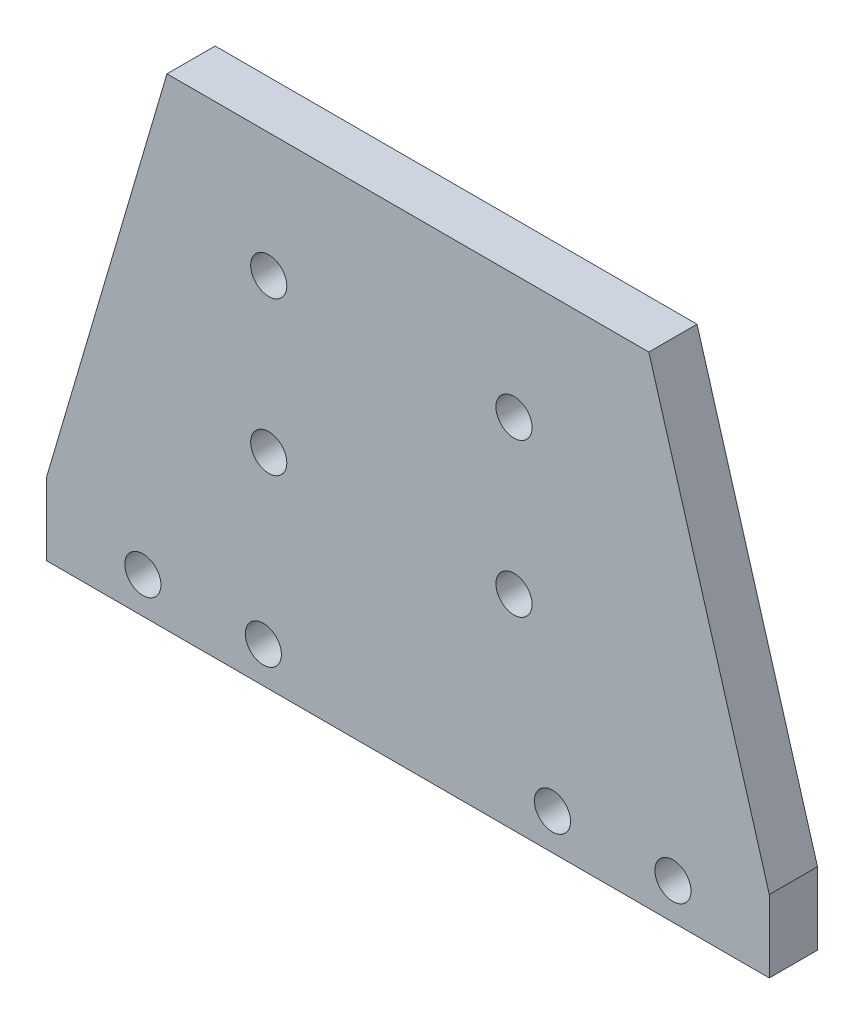
ISO-10303-21;
HEADER;
FILE_DESCRIPTION(('STEP AP214'),'2;1');
FILE_NAME('part.step','',(''),(''),'','','');
FILE_SCHEMA(('AUTOMOTIVE_DESIGN { 1 0 10303 214 1 1 1 1 }'));
ENDSEC;
DATA;
#1=APPLICATION_CONTEXT('core data for automotive mechanical design processes');
#2=APPLICATION_PROTOCOL_DEFINITION('international standard','automotive_design',2000,#1);
#3=PRODUCT_CONTEXT('',#1,'mechanical');
#4=PRODUCT('Part','Part','',(#3));
#5=PRODUCT_RELATED_PRODUCT_CATEGORY('part','',(#4));
#6=PRODUCT_DEFINITION_FORMATION('','',#4);
#7=PRODUCT_DEFINITION_CONTEXT('part definition',#1,'design');
#8=PRODUCT_DEFINITION('design','',#6,#7);
#9=PRODUCT_DEFINITION_SHAPE('','',#8);
#10=(LENGTH_UNIT() NAMED_UNIT(*) SI_UNIT(.MILLI.,.METRE.));
#11=(NAMED_UNIT(*) PLANE_ANGLE_UNIT() SI_UNIT($,.RADIAN.));
#12=(NAMED_UNIT(*) SI_UNIT($,.STERADIAN.) SOLID_ANGLE_UNIT());
#13=UNCERTAINTY_MEASURE_WITH_UNIT(LENGTH_MEASURE(1.E-05),#10,'distance_accuracy_value','');
#14=(GEOMETRIC_REPRESENTATION_CONTEXT(3) GLOBAL_UNCERTAINTY_ASSIGNED_CONTEXT((#13)) GLOBAL_UNIT_ASSIGNED_CONTEXT((#10,
#11,#12)) REPRESENTATION_CONTEXT('',''));
#15=CARTESIAN_POINT('',(0.,0.,0.));
#16=DIRECTION('',(0.,0.,1.));
#17=DIRECTION('',(1.,0.,0.));
#18=AXIS2_PLACEMENT_3D('',#15,#16,#17);
#19=CARTESIAN_POINT('',(30.,-20.,4.));
#20=DIRECTION('',(-1.,0.,0.));
#21=DIRECTION('',(0.,0.,1.));
#22=AXIS2_PLACEMENT_3D('',#19,#20,#21);
#23=PLANE('',#22);
#24=DIRECTION('',(0.,0.,-1.));
#25=VECTOR('',#24,1.);
#26=CARTESIAN_POINT('',(30.,-14.,4.000012));
#27=LINE('',#26,#25);
#28=CARTESIAN_POINT('',(30.,-14.,4.));
#29=VERTEX_POINT('',#28);
#30=CARTESIAN_POINT('',(30.,-14.,0.));
#31=VERTEX_POINT('',#30);
#32=EDGE_CURVE('E67',#29,#31,#27,.T.);
#33=ORIENTED_EDGE('',*,*,#32,.F.);
#34=DIRECTION('',(0.,1.,0.));
#35=VECTOR('',#34,1.);
#36=CARTESIAN_POINT('',(30.,-20.,4.));
#37=LINE('',#36,#35);
#38=CARTESIAN_POINT('',(30.,-20.,4.));
#39=VERTEX_POINT('',#38);
#40=EDGE_CURVE('E119',#39,#29,#37,.T.);
#41=ORIENTED_EDGE('',*,*,#40,.F.);
#42=DIRECTION('',(0.,0.,-1.));
#43=VECTOR('',#42,1.);
#44=CARTESIAN_POINT('',(30.,-20.,4.));
#45=LINE('',#44,#43);
#46=CARTESIAN_POINT('',(30.,-20.,0.));
#47=VERTEX_POINT('',#46);
#48=EDGE_CURVE('E51',#39,#47,#45,.T.);
#49=ORIENTED_EDGE('',*,*,#48,.T.);
#50=DIRECTION('',(0.,1.,0.));
#51=VECTOR('',#50,1.);
#52=CARTESIAN_POINT('',(30.,-20.,0.));
#53=LINE('',#52,#51);
#54=EDGE_CURVE('E121',#47,#31,#53,.T.);
#55=ORIENTED_EDGE('',*,*,#54,.T.);
#56=EDGE_LOOP('',(#33,#41,#49,#55));
#57=FACE_BOUND('',#56,.T.);
#58=ADVANCED_FACE('F43',(#57),#23,.F.);
#59=CARTESIAN_POINT('',(-30.,20.,4.));
#60=DIRECTION('',(0.,-1.,0.));
#61=DIRECTION('',(0.,0.,-1.));
#62=AXIS2_PLACEMENT_3D('',#59,#60,#61);
#63=PLANE('',#62);
#64=DIRECTION('',(0.,0.,-1.));
#65=VECTOR('',#64,1.);
#66=CARTESIAN_POINT('',(-20.,20.,4.000012));
#67=LINE('',#66,#65);
#68=CARTESIAN_POINT('',(-20.,20.,4.));
#69=VERTEX_POINT('',#68);
#70=CARTESIAN_POINT('',(-20.,20.,0.));
#71=VERTEX_POINT('',#70);
#72=EDGE_CURVE('E59',#69,#71,#67,.T.);
#73=ORIENTED_EDGE('',*,*,#72,.F.);
#74=DIRECTION('',(-1.,0.,0.));
#75=VECTOR('',#74,1.);
#76=CARTESIAN_POINT('',(-30.,20.,4.));
#77=LINE('',#76,#75);
#78=CARTESIAN_POINT('',(20.,20.,4.));
#79=VERTEX_POINT('',#78);
#80=EDGE_CURVE('E176',#79,#69,#77,.T.);
#81=ORIENTED_EDGE('',*,*,#80,.F.);
#82=DIRECTION('',(0.,0.,-1.));
#83=VECTOR('',#82,1.);
#84=CARTESIAN_POINT('',(20.,20.,4.000012));
#85=LINE('',#84,#83);
#86=CARTESIAN_POINT('',(20.,20.,0.));
#87=VERTEX_POINT('',#86);
#88=EDGE_CURVE('E164',#79,#87,#85,.T.);
#89=ORIENTED_EDGE('',*,*,#88,.T.);
#90=DIRECTION('',(-1.,0.,0.));
#91=VECTOR('',#90,1.);
#92=CARTESIAN_POINT('',(-30.,20.,0.));
#93=LINE('',#92,#91);
#94=EDGE_CURVE('E117',#87,#71,#93,.T.);
#95=ORIENTED_EDGE('',*,*,#94,.T.);
#96=EDGE_LOOP('',(#73,#81,#89,#95));
#97=FACE_BOUND('',#96,.T.);
#98=ADVANCED_FACE('F188',(#97),#63,.F.);
#99=CARTESIAN_POINT('',(-30.,-20.,4.));
#100=DIRECTION('',(1.,0.,0.));
#101=DIRECTION('',(0.,0.,-1.));
#102=AXIS2_PLACEMENT_3D('',#99,#100,#101);
#103=PLANE('',#102);
#104=DIRECTION('',(0.,0.,-1.));
#105=VECTOR('',#104,1.);
#106=CARTESIAN_POINT('',(-30.,-14.,4.000012));
#107=LINE('',#106,#105);
#108=CARTESIAN_POINT('',(-30.,-14.,4.));
#109=VERTEX_POINT('',#108);
#110=CARTESIAN_POINT('',(-30.,-14.,0.));
#111=VERTEX_POINT('',#110);
#112=EDGE_CURVE('E97',#109,#111,#107,.T.);
#113=ORIENTED_EDGE('',*,*,#112,.T.);
#114=DIRECTION('',(0.,-1.,0.));
#115=VECTOR('',#114,1.);
#116=CARTESIAN_POINT('',(-30.,-20.,0.));
#117=LINE('',#116,#115);
#118=CARTESIAN_POINT('',(-30.,-20.,0.));
#119=VERTEX_POINT('',#118);
#120=EDGE_CURVE('E109',#111,#119,#117,.T.);
#121=ORIENTED_EDGE('',*,*,#120,.T.);
#122=DIRECTION('',(0.,0.,-1.));
#123=VECTOR('',#122,1.);
#124=CARTESIAN_POINT('',(-30.,-20.,4.));
#125=LINE('',#124,#123);
#126=CARTESIAN_POINT('',(-30.,-20.,4.));
#127=VERTEX_POINT('',#126);
#128=EDGE_CURVE('E11',#127,#119,#125,.T.);
#129=ORIENTED_EDGE('',*,*,#128,.F.);
#130=DIRECTION('',(0.,-1.,0.));
#131=VECTOR('',#130,1.);
#132=CARTESIAN_POINT('',(-30.,-20.,4.));
#133=LINE('',#132,#131);
#134=EDGE_CURVE('E110',#109,#127,#133,.T.);
#135=ORIENTED_EDGE('',*,*,#134,.F.);
#136=EDGE_LOOP('',(#113,#121,#129,#135));
#137=FACE_BOUND('',#136,.T.);
#138=ADVANCED_FACE('F107',(#137),#103,.F.);
#139=CARTESIAN_POINT('',(0.,0.,4.));
#140=DIRECTION('',(0.,0.,-1.));
#141=DIRECTION('',(-1.,0.,0.));
#142=AXIS2_PLACEMENT_3D('',#139,#140,#141);
#143=PLANE('',#142);
#144=CARTESIAN_POINT('',(-11.5523120479037,9.71625644938022,4.));
#145=DIRECTION('',(0.,0.,1.));
#146=DIRECTION('',(1.,0.,0.));
#147=AXIS2_PLACEMENT_3D('',#144,#145,#146);
#148=CIRCLE('',#147,1.50000000010472);
#149=CARTESIAN_POINT('',(-10.052312047799,9.71625644938022,4.));
#150=VERTEX_POINT('',#149);
#151=EDGE_CURVE('E262',#150,#150,#148,.T.);
#152=ORIENTED_EDGE('',*,*,#151,.F.);
#153=EDGE_LOOP('',(#152));
#154=FACE_BOUND('',#153,.T.);
#155=CARTESIAN_POINT('',(8.80778672416417,-2.99728939019158,4.));
#156=DIRECTION('',(0.,0.,1.));
#157=DIRECTION('',(1.,0.,0.));
#158=AXIS2_PLACEMENT_3D('',#155,#156,#157);
#159=CIRCLE('',#158,1.50000000010471);
#160=CARTESIAN_POINT('',(10.3077867242689,-2.99728939019158,4.));
#161=VERTEX_POINT('',#160);
#162=EDGE_CURVE('E259',#161,#161,#159,.T.);
#163=ORIENTED_EDGE('',*,*,#162,.F.);
#164=EDGE_LOOP('',(#163));
#165=FACE_BOUND('',#164,.T.);
#166=CARTESIAN_POINT('',(8.80778672416417,9.71625644938022,4.));
#167=DIRECTION('',(0.,0.,1.));
#168=DIRECTION('',(1.,0.,0.));
#169=AXIS2_PLACEMENT_3D('',#166,#167,#168);
#170=CIRCLE('',#169,1.50000000010472);
#171=CARTESIAN_POINT('',(10.3077867242689,9.71625644938022,4.));
#172=VERTEX_POINT('',#171);
#173=EDGE_CURVE('E257',#172,#172,#170,.T.);
#174=ORIENTED_EDGE('',*,*,#173,.F.);
#175=EDGE_LOOP('',(#174));
#176=FACE_BOUND('',#175,.T.);
#177=CARTESIAN_POINT('',(-11.5523120479037,-2.99728939019158,4.));
#178=DIRECTION('',(0.,0.,1.));
#179=DIRECTION('',(1.,0.,0.));
#180=AXIS2_PLACEMENT_3D('',#177,#178,#179);
#181=CIRCLE('',#180,1.50000000010471);
#182=CARTESIAN_POINT('',(-10.052312047799,-2.99728939019158,4.));
#183=VERTEX_POINT('',#182);
#184=EDGE_CURVE('E132',#183,#183,#181,.T.);
#185=ORIENTED_EDGE('',*,*,#184,.F.);
#186=EDGE_LOOP('',(#185));
#187=FACE_BOUND('',#186,.T.);
#188=CARTESIAN_POINT('',(-22.,-17.,4.));
#189=DIRECTION('',(0.,0.,-1.));
#190=DIRECTION('',(-1.,0.,0.));
#191=AXIS2_PLACEMENT_3D('',#188,#189,#190);
#192=CIRCLE('',#191,1.5);
#193=CARTESIAN_POINT('',(-23.5,-17.,4.));
#194=VERTEX_POINT('',#193);
#195=EDGE_CURVE('E162',#194,#194,#192,.T.);
#196=ORIENTED_EDGE('',*,*,#195,.T.);
#197=EDGE_LOOP('',(#196));
#198=FACE_BOUND('',#197,.T.);
#199=CARTESIAN_POINT('',(-12.,-17.,4.));
#200=DIRECTION('',(0.,0.,-1.));
#201=DIRECTION('',(-1.,0.,0.));
#202=AXIS2_PLACEMENT_3D('',#199,#200,#201);
#203=CIRCLE('',#202,1.5);
#204=CARTESIAN_POINT('',(-13.5,-17.,4.));
#205=VERTEX_POINT('',#204);
#206=EDGE_CURVE('E159',#205,#205,#203,.T.);
#207=ORIENTED_EDGE('',*,*,#206,.T.);
#208=EDGE_LOOP('',(#207));
#209=FACE_BOUND('',#208,.T.);
#210=CARTESIAN_POINT('',(12.0000000000313,-16.9999999999999,4.));
#211=DIRECTION('',(0.,0.,-1.));
#212=DIRECTION('',(-1.,0.,0.));
#213=AXIS2_PLACEMENT_3D('',#210,#211,#212);
#214=CIRCLE('',#213,1.5);
#215=CARTESIAN_POINT('',(10.5000000000313,-16.9999999999999,4.));
#216=VERTEX_POINT('',#215);
#217=EDGE_CURVE('E155',#216,#216,#214,.T.);
#218=ORIENTED_EDGE('',*,*,#217,.T.);
#219=EDGE_LOOP('',(#218));
#220=FACE_BOUND('',#219,.T.);
#221=CARTESIAN_POINT('',(22.0000000000313,-16.9999999999999,4.));
#222=DIRECTION('',(0.,0.,-1.));
#223=DIRECTION('',(-1.,0.,0.));
#224=AXIS2_PLACEMENT_3D('',#221,#222,#223);
#225=CIRCLE('',#224,1.5);
#226=CARTESIAN_POINT('',(20.5000000000313,-16.9999999999999,4.));
#227=VERTEX_POINT('',#226);
#228=EDGE_CURVE('E152',#227,#227,#225,.T.);
#229=ORIENTED_EDGE('',*,*,#228,.T.);
#230=EDGE_LOOP('',(#229));
#231=FACE_BOUND('',#230,.T.);
#232=DIRECTION('',(0.28216632399155,0.959365501571271,0.));
#233=VECTOR('',#232,1.);
#234=CARTESIAN_POINT('',(-23.8216560509554,7.00636942675159,4.));
#235=LINE('',#234,#233);
#236=EDGE_CURVE('E172',#109,#69,#235,.T.);
#237=ORIENTED_EDGE('',*,*,#236,.F.);
#238=ORIENTED_EDGE('',*,*,#134,.T.);
#239=DIRECTION('',(1.,0.,0.));
#240=VECTOR('',#239,1.);
#241=CARTESIAN_POINT('',(-30.,-20.,4.));
#242=LINE('',#241,#240);
#243=EDGE_CURVE('E126',#127,#39,#242,.T.);
#244=ORIENTED_EDGE('',*,*,#243,.T.);
#245=ORIENTED_EDGE('',*,*,#40,.T.);
#246=DIRECTION('',(0.28216632399155,-0.959365501571271,0.));
#247=VECTOR('',#246,1.);
#248=CARTESIAN_POINT('',(23.8216560509554,7.00636942675159,4.));
#249=LINE('',#248,#247);
#250=EDGE_CURVE('E111',#79,#29,#249,.T.);
#251=ORIENTED_EDGE('',*,*,#250,.F.);
#252=ORIENTED_EDGE('',*,*,#80,.T.);
#253=EDGE_LOOP('',(#237,#238,#244,#245,#251,#252));
#254=FACE_BOUND('',#253,.T.);
#255=ADVANCED_FACE('F190',(#154,#165,#176,#187,#198,#209,#220,#231,#254),#143,.F.);
#256=CARTESIAN_POINT('',(0.,0.,0.));
#257=DIRECTION('',(0.,0.,-1.));
#258=DIRECTION('',(-1.,0.,0.));
#259=AXIS2_PLACEMENT_3D('',#256,#257,#258);
#260=PLANE('',#259);
#261=CARTESIAN_POINT('',(-11.5523120479037,9.71625644938022,0.));
#262=DIRECTION('',(0.,0.,-1.));
#263=DIRECTION('',(-1.,0.,0.));
#264=AXIS2_PLACEMENT_3D('',#261,#262,#263);
#265=CIRCLE('',#264,1.50000000010472);
#266=CARTESIAN_POINT('',(-13.0523120480084,9.71625644938022,0.));
#267=VERTEX_POINT('',#266);
#268=EDGE_CURVE('E46',#267,#267,#265,.T.);
#269=ORIENTED_EDGE('',*,*,#268,.F.);
#270=EDGE_LOOP('',(#269));
#271=FACE_BOUND('',#270,.T.);
#272=CARTESIAN_POINT('',(8.80778672416417,-2.99728939019158,0.));
#273=DIRECTION('',(0.,0.,-1.));
#274=DIRECTION('',(-1.,0.,0.));
#275=AXIS2_PLACEMENT_3D('',#272,#273,#274);
#276=CIRCLE('',#275,1.50000000010471);
#277=CARTESIAN_POINT('',(7.30778672405946,-2.99728939019158,0.));
#278=VERTEX_POINT('',#277);
#279=EDGE_CURVE('E134',#278,#278,#276,.T.);
#280=ORIENTED_EDGE('',*,*,#279,.F.);
#281=EDGE_LOOP('',(#280));
#282=FACE_BOUND('',#281,.T.);
#283=CARTESIAN_POINT('',(8.80778672416417,9.71625644938022,0.));
#284=DIRECTION('',(0.,0.,-1.));
#285=DIRECTION('',(-1.,0.,0.));
#286=AXIS2_PLACEMENT_3D('',#283,#284,#285);
#287=CIRCLE('',#286,1.50000000010472);
#288=CARTESIAN_POINT('',(7.30778672405946,9.71625644938022,0.));
#289=VERTEX_POINT('',#288);
#290=EDGE_CURVE('E131',#289,#289,#287,.T.);
#291=ORIENTED_EDGE('',*,*,#290,.F.);
#292=EDGE_LOOP('',(#291));
#293=FACE_BOUND('',#292,.T.);
#294=CARTESIAN_POINT('',(-11.5523120479037,-2.99728939019158,0.));
#295=DIRECTION('',(0.,0.,-1.));
#296=DIRECTION('',(-1.,0.,0.));
#297=AXIS2_PLACEMENT_3D('',#294,#295,#296);
#298=CIRCLE('',#297,1.50000000010471);
#299=CARTESIAN_POINT('',(-13.0523120480084,-2.99728939019158,0.));
#300=VERTEX_POINT('',#299);
#301=EDGE_CURVE('E128',#300,#300,#298,.T.);
#302=ORIENTED_EDGE('',*,*,#301,.F.);
#303=EDGE_LOOP('',(#302));
#304=FACE_BOUND('',#303,.T.);
#305=CARTESIAN_POINT('',(-22.,-17.,0.));
#306=DIRECTION('',(0.,0.,-1.));
#307=DIRECTION('',(-1.,0.,0.));
#308=AXIS2_PLACEMENT_3D('',#305,#306,#307);
#309=CIRCLE('',#308,1.5);
#310=CARTESIAN_POINT('',(-23.5,-17.,0.));
#311=VERTEX_POINT('',#310);
#312=EDGE_CURVE('E156',#311,#311,#309,.T.);
#313=ORIENTED_EDGE('',*,*,#312,.F.);
#314=EDGE_LOOP('',(#313));
#315=FACE_BOUND('',#314,.T.);
#316=CARTESIAN_POINT('',(-12.,-17.,0.));
#317=DIRECTION('',(0.,0.,-1.));
#318=DIRECTION('',(-1.,0.,0.));
#319=AXIS2_PLACEMENT_3D('',#316,#317,#318);
#320=CIRCLE('',#319,1.5);
#321=CARTESIAN_POINT('',(-13.5,-17.,0.));
#322=VERTEX_POINT('',#321);
#323=EDGE_CURVE('E148',#322,#322,#320,.T.);
#324=ORIENTED_EDGE('',*,*,#323,.F.);
#325=EDGE_LOOP('',(#324));
#326=FACE_BOUND('',#325,.T.);
#327=CARTESIAN_POINT('',(12.0000000000313,-16.9999999999999,0.));
#328=DIRECTION('',(0.,0.,-1.));
#329=DIRECTION('',(-1.,0.,0.));
#330=AXIS2_PLACEMENT_3D('',#327,#328,#329);
#331=CIRCLE('',#330,1.5);
#332=CARTESIAN_POINT('',(10.5000000000313,-16.9999999999999,0.));
#333=VERTEX_POINT('',#332);
#334=EDGE_CURVE('E143',#333,#333,#331,.T.);
#335=ORIENTED_EDGE('',*,*,#334,.F.);
#336=EDGE_LOOP('',(#335));
#337=FACE_BOUND('',#336,.T.);
#338=CARTESIAN_POINT('',(22.0000000000313,-16.9999999999999,0.));
#339=DIRECTION('',(0.,0.,-1.));
#340=DIRECTION('',(-1.,0.,0.));
#341=AXIS2_PLACEMENT_3D('',#338,#339,#340);
#342=CIRCLE('',#341,1.5);
#343=CARTESIAN_POINT('',(20.5000000000313,-16.9999999999999,0.));
#344=VERTEX_POINT('',#343);
#345=EDGE_CURVE('E139',#344,#344,#342,.T.);
#346=ORIENTED_EDGE('',*,*,#345,.F.);
#347=EDGE_LOOP('',(#346));
#348=FACE_BOUND('',#347,.T.);
#349=ORIENTED_EDGE('',*,*,#120,.F.);
#350=DIRECTION('',(0.28216632399155,0.959365501571271,0.));
#351=VECTOR('',#350,1.);
#352=CARTESIAN_POINT('',(-30.,-14.,0.));
#353=LINE('',#352,#351);
#354=EDGE_CURVE('E94',#111,#71,#353,.T.);
#355=ORIENTED_EDGE('',*,*,#354,.T.);
#356=ORIENTED_EDGE('',*,*,#94,.F.);
#357=DIRECTION('',(0.28216632399155,-0.959365501571271,0.));
#358=VECTOR('',#357,1.);
#359=CARTESIAN_POINT('',(30.,-14.,0.));
#360=LINE('',#359,#358);
#361=EDGE_CURVE('E103',#87,#31,#360,.T.);
#362=ORIENTED_EDGE('',*,*,#361,.T.);
#363=ORIENTED_EDGE('',*,*,#54,.F.);
#364=DIRECTION('',(1.,0.,0.));
#365=VECTOR('',#364,1.);
#366=CARTESIAN_POINT('',(-30.,-20.,0.));
#367=LINE('',#366,#365);
#368=EDGE_CURVE('E116',#119,#47,#367,.T.);
#369=ORIENTED_EDGE('',*,*,#368,.F.);
#370=EDGE_LOOP('',(#349,#355,#356,#362,#363,#369));
#371=FACE_BOUND('',#370,.T.);
#372=ADVANCED_FACE('F114',(#271,#282,#293,#304,#315,#326,#337,#348,#371),#260,.T.);
#373=CARTESIAN_POINT('',(-30.,-20.,4.));
#374=DIRECTION('',(0.,1.,0.));
#375=DIRECTION('',(0.,0.,1.));
#376=AXIS2_PLACEMENT_3D('',#373,#374,#375);
#377=PLANE('',#376);
#378=ORIENTED_EDGE('',*,*,#368,.T.);
#379=ORIENTED_EDGE('',*,*,#48,.F.);
#380=ORIENTED_EDGE('',*,*,#243,.F.);
#381=ORIENTED_EDGE('',*,*,#128,.T.);
#382=EDGE_LOOP('',(#378,#379,#380,#381));
#383=FACE_BOUND('',#382,.T.);
#384=ADVANCED_FACE('F193',(#383),#377,.F.);
#385=CARTESIAN_POINT('',(30.,-14.,4.000012));
#386=DIRECTION('',(0.959365501571271,0.28216632399155,0.));
#387=DIRECTION('',(-0.28216632399155,0.959365501571271,0.));
#388=AXIS2_PLACEMENT_3D('',#385,#386,#387);
#389=PLANE('',#388);
#390=ORIENTED_EDGE('',*,*,#250,.T.);
#391=ORIENTED_EDGE('',*,*,#32,.T.);
#392=ORIENTED_EDGE('',*,*,#361,.F.);
#393=ORIENTED_EDGE('',*,*,#88,.F.);
#394=EDGE_LOOP('',(#390,#391,#392,#393));
#395=FACE_BOUND('',#394,.T.);
#396=ADVANCED_FACE('F184',(#395),#389,.T.);
#397=CARTESIAN_POINT('',(-30.,-14.,4.000012));
#398=DIRECTION('',(-0.959365501571271,0.28216632399155,0.));
#399=DIRECTION('',(-0.28216632399155,-0.959365501571271,0.));
#400=AXIS2_PLACEMENT_3D('',#397,#398,#399);
#401=PLANE('',#400);
#402=ORIENTED_EDGE('',*,*,#236,.T.);
#403=ORIENTED_EDGE('',*,*,#72,.T.);
#404=ORIENTED_EDGE('',*,*,#354,.F.);
#405=ORIENTED_EDGE('',*,*,#112,.F.);
#406=EDGE_LOOP('',(#402,#403,#404,#405));
#407=FACE_BOUND('',#406,.T.);
#408=ADVANCED_FACE('F96',(#407),#401,.T.);
#409=CARTESIAN_POINT('',(22.0000000000313,-16.9999999999999,10.));
#410=DIRECTION('',(0.,0.,-1.));
#411=DIRECTION('',(-1.,0.,0.));
#412=AXIS2_PLACEMENT_3D('',#409,#410,#411);
#413=CYLINDRICAL_SURFACE('',#412,1.5);
#414=ORIENTED_EDGE('',*,*,#345,.T.);
#415=EDGE_LOOP('',(#414));
#416=FACE_BOUND('',#415,.T.);
#417=ORIENTED_EDGE('',*,*,#228,.F.);
#418=EDGE_LOOP('',(#417));
#419=FACE_BOUND('',#418,.T.);
#420=ADVANCED_FACE('F224',(#416,#419),#413,.F.);
#421=CARTESIAN_POINT('',(12.0000000000313,-16.9999999999999,10.));
#422=DIRECTION('',(0.,0.,-1.));
#423=DIRECTION('',(-1.,0.,0.));
#424=AXIS2_PLACEMENT_3D('',#421,#422,#423);
#425=CYLINDRICAL_SURFACE('',#424,1.5);
#426=ORIENTED_EDGE('',*,*,#334,.T.);
#427=EDGE_LOOP('',(#426));
#428=FACE_BOUND('',#427,.T.);
#429=ORIENTED_EDGE('',*,*,#217,.F.);
#430=EDGE_LOOP('',(#429));
#431=FACE_BOUND('',#430,.T.);
#432=ADVANCED_FACE('F227',(#428,#431),#425,.F.);
#433=CARTESIAN_POINT('',(-12.,-17.,10.));
#434=DIRECTION('',(0.,0.,-1.));
#435=DIRECTION('',(-1.,0.,0.));
#436=AXIS2_PLACEMENT_3D('',#433,#434,#435);
#437=CYLINDRICAL_SURFACE('',#436,1.5);
#438=ORIENTED_EDGE('',*,*,#323,.T.);
#439=EDGE_LOOP('',(#438));
#440=FACE_BOUND('',#439,.T.);
#441=ORIENTED_EDGE('',*,*,#206,.F.);
#442=EDGE_LOOP('',(#441));
#443=FACE_BOUND('',#442,.T.);
#444=ADVANCED_FACE('F230',(#440,#443),#437,.F.);
#445=CARTESIAN_POINT('',(-22.,-17.,10.));
#446=DIRECTION('',(0.,0.,-1.));
#447=DIRECTION('',(-1.,0.,0.));
#448=AXIS2_PLACEMENT_3D('',#445,#446,#447);
#449=CYLINDRICAL_SURFACE('',#448,1.5);
#450=ORIENTED_EDGE('',*,*,#312,.T.);
#451=EDGE_LOOP('',(#450));
#452=FACE_BOUND('',#451,.T.);
#453=ORIENTED_EDGE('',*,*,#195,.F.);
#454=EDGE_LOOP('',(#453));
#455=FACE_BOUND('',#454,.T.);
#456=ADVANCED_FACE('F234',(#452,#455),#449,.F.);
#457=CARTESIAN_POINT('',(-11.5523120479037,-2.99728939019158,-19.));
#458=DIRECTION('',(0.,0.,1.));
#459=DIRECTION('',(1.,0.,0.));
#460=AXIS2_PLACEMENT_3D('',#457,#458,#459);
#461=CYLINDRICAL_SURFACE('',#460,1.50000000010471);
#462=ORIENTED_EDGE('',*,*,#301,.T.);
#463=EDGE_LOOP('',(#462));
#464=FACE_BOUND('',#463,.T.);
#465=ORIENTED_EDGE('',*,*,#184,.T.);
#466=EDGE_LOOP('',(#465));
#467=FACE_BOUND('',#466,.T.);
#468=ADVANCED_FACE('F237',(#464,#467),#461,.F.);
#469=CARTESIAN_POINT('',(8.80778672416417,9.71625644938022,-19.));
#470=DIRECTION('',(0.,0.,1.));
#471=DIRECTION('',(1.,0.,0.));
#472=AXIS2_PLACEMENT_3D('',#469,#470,#471);
#473=CYLINDRICAL_SURFACE('',#472,1.50000000010472);
#474=ORIENTED_EDGE('',*,*,#290,.T.);
#475=EDGE_LOOP('',(#474));
#476=FACE_BOUND('',#475,.T.);
#477=ORIENTED_EDGE('',*,*,#173,.T.);
#478=EDGE_LOOP('',(#477));
#479=FACE_BOUND('',#478,.T.);
#480=ADVANCED_FACE('F241',(#476,#479),#473,.F.);
#481=CARTESIAN_POINT('',(8.80778672416417,-2.99728939019158,-19.));
#482=DIRECTION('',(0.,0.,1.));
#483=DIRECTION('',(1.,0.,0.));
#484=AXIS2_PLACEMENT_3D('',#481,#482,#483);
#485=CYLINDRICAL_SURFACE('',#484,1.50000000010471);
#486=ORIENTED_EDGE('',*,*,#279,.T.);
#487=EDGE_LOOP('',(#486));
#488=FACE_BOUND('',#487,.T.);
#489=ORIENTED_EDGE('',*,*,#162,.T.);
#490=EDGE_LOOP('',(#489));
#491=FACE_BOUND('',#490,.T.);
#492=ADVANCED_FACE('F243',(#488,#491),#485,.F.);
#493=CARTESIAN_POINT('',(-11.5523120479037,9.71625644938022,-19.));
#494=DIRECTION('',(0.,0.,1.));
#495=DIRECTION('',(1.,0.,0.));
#496=AXIS2_PLACEMENT_3D('',#493,#494,#495);
#497=CYLINDRICAL_SURFACE('',#496,1.50000000010472);
#498=ORIENTED_EDGE('',*,*,#268,.T.);
#499=EDGE_LOOP('',(#498));
#500=FACE_BOUND('',#499,.T.);
#501=ORIENTED_EDGE('',*,*,#151,.T.);
#502=EDGE_LOOP('',(#501));
#503=FACE_BOUND('',#502,.T.);
#504=ADVANCED_FACE('F246',(#500,#503),#497,.F.);
#505=CLOSED_SHELL('',(#58,#98,#138,#255,#372,#384,#396,#408,#420,#432,#444,#456,#468,#480,#492,#504));
#506=MANIFOLD_SOLID_BREP('B2',#505);
#507=ADVANCED_BREP_SHAPE_REPRESENTATION('',(#18,#506),#14);
#508=SHAPE_DEFINITION_REPRESENTATION(#9,#507);
ENDSEC;
END-ISO-10303-21;
